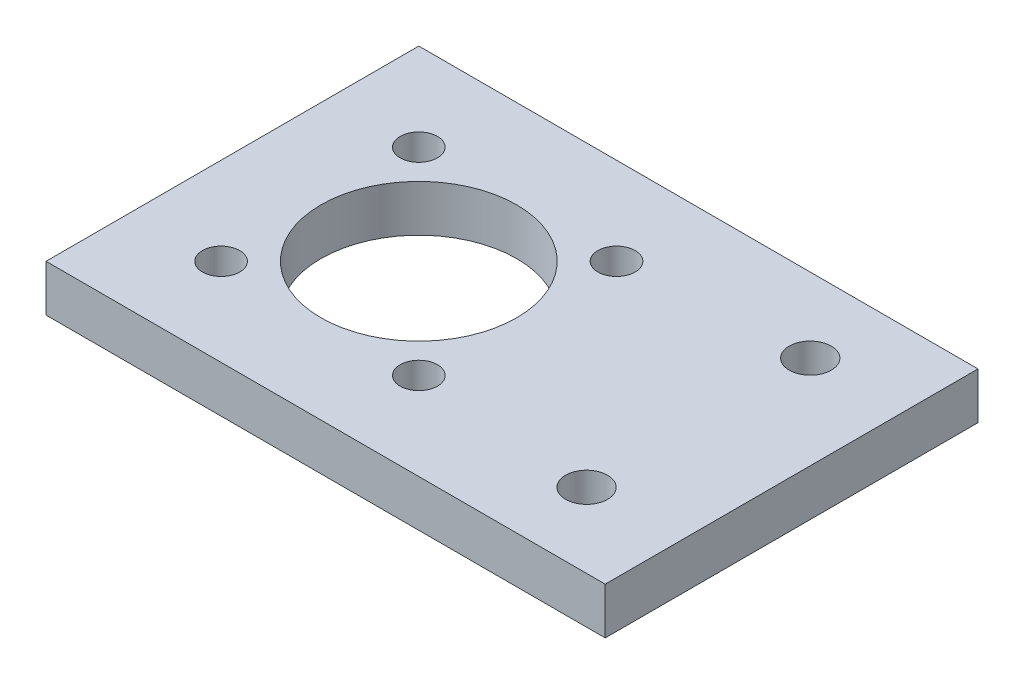
ISO-10303-21;
HEADER;
FILE_DESCRIPTION(('STEP AP214'),'2;1');
FILE_NAME('part.step','',(''),(''),'','','');
FILE_SCHEMA(('AUTOMOTIVE_DESIGN { 1 0 10303 214 1 1 1 1 }'));
ENDSEC;
DATA;
#1=APPLICATION_CONTEXT('core data for automotive mechanical design processes');
#2=APPLICATION_PROTOCOL_DEFINITION('international standard','automotive_design',2000,#1);
#3=PRODUCT_CONTEXT('',#1,'mechanical');
#4=PRODUCT('Part','Part','',(#3));
#5=PRODUCT_RELATED_PRODUCT_CATEGORY('part','',(#4));
#6=PRODUCT_DEFINITION_FORMATION('','',#4);
#7=PRODUCT_DEFINITION_CONTEXT('part definition',#1,'design');
#8=PRODUCT_DEFINITION('design','',#6,#7);
#9=PRODUCT_DEFINITION_SHAPE('','',#8);
#10=(LENGTH_UNIT() NAMED_UNIT(*) SI_UNIT(.MILLI.,.METRE.));
#11=(NAMED_UNIT(*) PLANE_ANGLE_UNIT() SI_UNIT($,.RADIAN.));
#12=(NAMED_UNIT(*) SI_UNIT($,.STERADIAN.) SOLID_ANGLE_UNIT());
#13=UNCERTAINTY_MEASURE_WITH_UNIT(LENGTH_MEASURE(1.E-05),#10,'distance_accuracy_value','');
#14=(GEOMETRIC_REPRESENTATION_CONTEXT(3) GLOBAL_UNCERTAINTY_ASSIGNED_CONTEXT((#13)) GLOBAL_UNIT_ASSIGNED_CONTEXT((#10,
#11,#12)) REPRESENTATION_CONTEXT('',''));
#15=CARTESIAN_POINT('',(0.,0.,0.));
#16=DIRECTION('',(0.,0.,1.));
#17=DIRECTION('',(1.,0.,0.));
#18=AXIS2_PLACEMENT_3D('',#15,#16,#17);
#19=CARTESIAN_POINT('',(30.,5.,20.));
#20=DIRECTION('',(-1.,0.,0.));
#21=DIRECTION('',(0.,0.,1.));
#22=AXIS2_PLACEMENT_3D('',#19,#20,#21);
#23=PLANE('',#22);
#24=DIRECTION('',(0.,0.,-1.));
#25=VECTOR('',#24,1.);
#26=CARTESIAN_POINT('',(30.,0.,20.));
#27=LINE('',#26,#25);
#28=CARTESIAN_POINT('',(30.,0.,20.));
#29=VERTEX_POINT('',#28);
#30=CARTESIAN_POINT('',(30.,0.,-20.));
#31=VERTEX_POINT('',#30);
#32=EDGE_CURVE('E100',#29,#31,#27,.T.);
#33=ORIENTED_EDGE('',*,*,#32,.T.);
#34=DIRECTION('',(0.,-1.,0.));
#35=VECTOR('',#34,1.);
#36=CARTESIAN_POINT('',(30.,5.,-20.));
#37=LINE('',#36,#35);
#38=CARTESIAN_POINT('',(30.,5.,-20.));
#39=VERTEX_POINT('',#38);
#40=EDGE_CURVE('E11',#39,#31,#37,.T.);
#41=ORIENTED_EDGE('',*,*,#40,.F.);
#42=DIRECTION('',(0.,0.,-1.));
#43=VECTOR('',#42,1.);
#44=CARTESIAN_POINT('',(30.,5.,20.));
#45=LINE('',#44,#43);
#46=CARTESIAN_POINT('',(30.,5.,20.));
#47=VERTEX_POINT('',#46);
#48=EDGE_CURVE('E88',#47,#39,#45,.T.);
#49=ORIENTED_EDGE('',*,*,#48,.F.);
#50=DIRECTION('',(0.,-1.,0.));
#51=VECTOR('',#50,1.);
#52=CARTESIAN_POINT('',(30.,5.,20.));
#53=LINE('',#52,#51);
#54=EDGE_CURVE('E96',#47,#29,#53,.T.);
#55=ORIENTED_EDGE('',*,*,#54,.T.);
#56=EDGE_LOOP('',(#33,#41,#49,#55));
#57=FACE_BOUND('',#56,.T.);
#58=ADVANCED_FACE('F37',(#57),#23,.F.);
#59=CARTESIAN_POINT('',(-30.,5.,-20.));
#60=DIRECTION('',(0.,0.,1.));
#61=DIRECTION('',(1.,0.,0.));
#62=AXIS2_PLACEMENT_3D('',#59,#60,#61);
#63=PLANE('',#62);
#64=DIRECTION('',(-1.,0.,0.));
#65=VECTOR('',#64,1.);
#66=CARTESIAN_POINT('',(-30.,0.,-20.));
#67=LINE('',#66,#65);
#68=CARTESIAN_POINT('',(-30.,0.,-20.));
#69=VERTEX_POINT('',#68);
#70=EDGE_CURVE('E92',#31,#69,#67,.T.);
#71=ORIENTED_EDGE('',*,*,#70,.T.);
#72=DIRECTION('',(0.,-1.,0.));
#73=VECTOR('',#72,1.);
#74=CARTESIAN_POINT('',(-30.,5.,-20.));
#75=LINE('',#74,#73);
#76=CARTESIAN_POINT('',(-30.,5.,-20.));
#77=VERTEX_POINT('',#76);
#78=EDGE_CURVE('E45',#77,#69,#75,.T.);
#79=ORIENTED_EDGE('',*,*,#78,.F.);
#80=DIRECTION('',(-1.,0.,0.));
#81=VECTOR('',#80,1.);
#82=CARTESIAN_POINT('',(-30.,5.,-20.));
#83=LINE('',#82,#81);
#84=EDGE_CURVE('E83',#39,#77,#83,.T.);
#85=ORIENTED_EDGE('',*,*,#84,.F.);
#86=ORIENTED_EDGE('',*,*,#40,.T.);
#87=EDGE_LOOP('',(#71,#79,#85,#86));
#88=FACE_BOUND('',#87,.T.);
#89=ADVANCED_FACE('F91',(#88),#63,.F.);
#90=CARTESIAN_POINT('',(-30.,5.,20.));
#91=DIRECTION('',(1.,0.,0.));
#92=DIRECTION('',(0.,0.,-1.));
#93=AXIS2_PLACEMENT_3D('',#90,#91,#92);
#94=PLANE('',#93);
#95=DIRECTION('',(0.,0.,1.));
#96=VECTOR('',#95,1.);
#97=CARTESIAN_POINT('',(-30.,0.,20.));
#98=LINE('',#97,#96);
#99=CARTESIAN_POINT('',(-30.,0.,20.));
#100=VERTEX_POINT('',#99);
#101=EDGE_CURVE('E70',#69,#100,#98,.T.);
#102=ORIENTED_EDGE('',*,*,#101,.T.);
#103=DIRECTION('',(0.,-1.,0.));
#104=VECTOR('',#103,1.);
#105=CARTESIAN_POINT('',(-30.,5.,20.));
#106=LINE('',#105,#104);
#107=CARTESIAN_POINT('',(-30.,5.,20.));
#108=VERTEX_POINT('',#107);
#109=EDGE_CURVE('E93',#108,#100,#106,.T.);
#110=ORIENTED_EDGE('',*,*,#109,.F.);
#111=DIRECTION('',(0.,0.,1.));
#112=VECTOR('',#111,1.);
#113=CARTESIAN_POINT('',(-30.,5.,20.));
#114=LINE('',#113,#112);
#115=EDGE_CURVE('E86',#77,#108,#114,.T.);
#116=ORIENTED_EDGE('',*,*,#115,.F.);
#117=ORIENTED_EDGE('',*,*,#78,.T.);
#118=EDGE_LOOP('',(#102,#110,#116,#117));
#119=FACE_BOUND('',#118,.T.);
#120=ADVANCED_FACE('F94',(#119),#94,.F.);
#121=CARTESIAN_POINT('',(-30.,5.,20.));
#122=DIRECTION('',(0.,0.,-1.));
#123=DIRECTION('',(-1.,0.,0.));
#124=AXIS2_PLACEMENT_3D('',#121,#122,#123);
#125=PLANE('',#124);
#126=DIRECTION('',(1.,0.,0.));
#127=VECTOR('',#126,1.);
#128=CARTESIAN_POINT('',(-30.,0.,20.));
#129=LINE('',#128,#127);
#130=EDGE_CURVE('E76',#100,#29,#129,.T.);
#131=ORIENTED_EDGE('',*,*,#130,.T.);
#132=ORIENTED_EDGE('',*,*,#54,.F.);
#133=DIRECTION('',(1.,0.,0.));
#134=VECTOR('',#133,1.);
#135=CARTESIAN_POINT('',(-30.,5.,20.));
#136=LINE('',#135,#134);
#137=EDGE_CURVE('E53',#108,#47,#136,.T.);
#138=ORIENTED_EDGE('',*,*,#137,.F.);
#139=ORIENTED_EDGE('',*,*,#109,.T.);
#140=EDGE_LOOP('',(#131,#132,#138,#139));
#141=FACE_BOUND('',#140,.T.);
#142=ADVANCED_FACE('F108',(#141),#125,.F.);
#143=CARTESIAN_POINT('',(0.,5.,0.));
#144=DIRECTION('',(0.,-1.,0.));
#145=DIRECTION('',(0.,0.,-1.));
#146=AXIS2_PLACEMENT_3D('',#143,#144,#145);
#147=PLANE('',#146);
#148=CARTESIAN_POINT('',(0.606544962297295,5.,-10.6065273945976));
#149=DIRECTION('',(0.,1.,0.));
#150=DIRECTION('',(0.,0.,1.));
#151=AXIS2_PLACEMENT_3D('',#148,#149,#150);
#152=CIRCLE('',#151,2.);
#153=CARTESIAN_POINT('',(0.606544962297295,5.,-8.60652739459761));
#154=VERTEX_POINT('',#153);
#155=EDGE_CURVE('E129',#154,#154,#152,.T.);
#156=ORIENTED_EDGE('',*,*,#155,.F.);
#157=EDGE_LOOP('',(#156));
#158=FACE_BOUND('',#157,.T.);
#159=CARTESIAN_POINT('',(0.606544962297299,5.,10.6066760409988));
#160=DIRECTION('',(0.,1.,0.));
#161=DIRECTION('',(0.,0.,1.));
#162=AXIS2_PLACEMENT_3D('',#159,#160,#161);
#163=CIRCLE('',#162,2.);
#164=CARTESIAN_POINT('',(0.606544962297299,5.,12.6066760409988));
#165=VERTEX_POINT('',#164);
#166=EDGE_CURVE('E135',#165,#165,#163,.T.);
#167=ORIENTED_EDGE('',*,*,#166,.F.);
#168=EDGE_LOOP('',(#167));
#169=FACE_BOUND('',#168,.T.);
#170=CARTESIAN_POINT('',(-10.0000567555009,5.,7.43232006133109E-05));
#171=DIRECTION('',(0.,1.,0.));
#172=DIRECTION('',(0.,0.,1.));
#173=AXIS2_PLACEMENT_3D('',#170,#171,#172);
#174=CIRCLE('',#173,10.5);
#175=CARTESIAN_POINT('',(-10.0000567555009,5.,10.5000743232006));
#176=VERTEX_POINT('',#175);
#177=EDGE_CURVE('E147',#176,#176,#174,.T.);
#178=ORIENTED_EDGE('',*,*,#177,.F.);
#179=EDGE_LOOP('',(#178));
#180=FACE_BOUND('',#179,.T.);
#181=CARTESIAN_POINT('',(-20.6066584732991,5.,10.6066760409988));
#182=DIRECTION('',(0.,1.,0.));
#183=DIRECTION('',(0.,0.,1.));
#184=AXIS2_PLACEMENT_3D('',#181,#182,#183);
#185=CIRCLE('',#184,2.);
#186=CARTESIAN_POINT('',(-20.6066584732991,5.,12.6066760409988));
#187=VERTEX_POINT('',#186);
#188=EDGE_CURVE('E136',#187,#187,#185,.T.);
#189=ORIENTED_EDGE('',*,*,#188,.F.);
#190=EDGE_LOOP('',(#189));
#191=FACE_BOUND('',#190,.T.);
#192=CARTESIAN_POINT('',(-20.6066584732991,5.,-10.6065273945976));
#193=DIRECTION('',(0.,1.,0.));
#194=DIRECTION('',(0.,0.,1.));
#195=AXIS2_PLACEMENT_3D('',#192,#193,#194);
#196=CIRCLE('',#195,2.);
#197=CARTESIAN_POINT('',(-20.6066584732991,5.,-8.60652739459762));
#198=VERTEX_POINT('',#197);
#199=EDGE_CURVE('E126',#198,#198,#196,.T.);
#200=ORIENTED_EDGE('',*,*,#199,.F.);
#201=EDGE_LOOP('',(#200));
#202=FACE_BOUND('',#201,.T.);
#203=CARTESIAN_POINT('',(20.,5.,-12.));
#204=DIRECTION('',(0.,1.,0.));
#205=DIRECTION('',(0.,0.,1.));
#206=AXIS2_PLACEMENT_3D('',#203,#204,#205);
#207=CIRCLE('',#206,2.25);
#208=CARTESIAN_POINT('',(20.,5.,-9.75));
#209=VERTEX_POINT('',#208);
#210=EDGE_CURVE('E121',#209,#209,#207,.T.);
#211=ORIENTED_EDGE('',*,*,#210,.F.);
#212=EDGE_LOOP('',(#211));
#213=FACE_BOUND('',#212,.T.);
#214=CARTESIAN_POINT('',(20.,5.,12.));
#215=DIRECTION('',(0.,1.,0.));
#216=DIRECTION('',(0.,0.,-1.));
#217=AXIS2_PLACEMENT_3D('',#214,#215,#216);
#218=CIRCLE('',#217,2.25);
#219=CARTESIAN_POINT('',(20.,5.,9.75));
#220=VERTEX_POINT('',#219);
#221=EDGE_CURVE('E117',#220,#220,#218,.T.);
#222=ORIENTED_EDGE('',*,*,#221,.F.);
#223=EDGE_LOOP('',(#222));
#224=FACE_BOUND('',#223,.T.);
#225=ORIENTED_EDGE('',*,*,#48,.T.);
#226=ORIENTED_EDGE('',*,*,#84,.T.);
#227=ORIENTED_EDGE('',*,*,#115,.T.);
#228=ORIENTED_EDGE('',*,*,#137,.T.);
#229=EDGE_LOOP('',(#225,#226,#227,#228));
#230=FACE_BOUND('',#229,.T.);
#231=ADVANCED_FACE('F84',(#158,#169,#180,#191,#202,#213,#224,#230),#147,.F.);
#232=CARTESIAN_POINT('',(0.,0.,0.));
#233=DIRECTION('',(0.,-1.,0.));
#234=DIRECTION('',(0.,0.,-1.));
#235=AXIS2_PLACEMENT_3D('',#232,#233,#234);
#236=PLANE('',#235);
#237=CARTESIAN_POINT('',(0.606544962297295,0.,-10.6065273945976));
#238=DIRECTION('',(0.,1.,0.));
#239=DIRECTION('',(0.,0.,1.));
#240=AXIS2_PLACEMENT_3D('',#237,#238,#239);
#241=CIRCLE('',#240,2.);
#242=CARTESIAN_POINT('',(0.606544962297295,0.,-8.60652739459761));
#243=VERTEX_POINT('',#242);
#244=EDGE_CURVE('E139',#243,#243,#241,.T.);
#245=ORIENTED_EDGE('',*,*,#244,.T.);
#246=EDGE_LOOP('',(#245));
#247=FACE_BOUND('',#246,.T.);
#248=CARTESIAN_POINT('',(0.606544962297299,0.,10.6066760409988));
#249=DIRECTION('',(0.,1.,0.));
#250=DIRECTION('',(0.,0.,1.));
#251=AXIS2_PLACEMENT_3D('',#248,#249,#250);
#252=CIRCLE('',#251,2.);
#253=CARTESIAN_POINT('',(0.606544962297299,0.,12.6066760409988));
#254=VERTEX_POINT('',#253);
#255=EDGE_CURVE('E132',#254,#254,#252,.T.);
#256=ORIENTED_EDGE('',*,*,#255,.T.);
#257=EDGE_LOOP('',(#256));
#258=FACE_BOUND('',#257,.T.);
#259=CARTESIAN_POINT('',(-10.0000567555009,0.,7.43232006133109E-05));
#260=DIRECTION('',(0.,1.,0.));
#261=DIRECTION('',(0.,0.,1.));
#262=AXIS2_PLACEMENT_3D('',#259,#260,#261);
#263=CIRCLE('',#262,10.5);
#264=CARTESIAN_POINT('',(-10.0000567555009,0.,10.5000743232006));
#265=VERTEX_POINT('',#264);
#266=EDGE_CURVE('E150',#265,#265,#263,.T.);
#267=ORIENTED_EDGE('',*,*,#266,.T.);
#268=EDGE_LOOP('',(#267));
#269=FACE_BOUND('',#268,.T.);
#270=CARTESIAN_POINT('',(-20.6066584732991,0.,10.6066760409988));
#271=DIRECTION('',(0.,1.,0.));
#272=DIRECTION('',(0.,0.,1.));
#273=AXIS2_PLACEMENT_3D('',#270,#271,#272);
#274=CIRCLE('',#273,2.);
#275=CARTESIAN_POINT('',(-20.6066584732991,0.,12.6066760409988));
#276=VERTEX_POINT('',#275);
#277=EDGE_CURVE('E144',#276,#276,#274,.T.);
#278=ORIENTED_EDGE('',*,*,#277,.T.);
#279=EDGE_LOOP('',(#278));
#280=FACE_BOUND('',#279,.T.);
#281=CARTESIAN_POINT('',(-20.6066584732991,0.,-10.6065273945976));
#282=DIRECTION('',(0.,1.,0.));
#283=DIRECTION('',(0.,0.,1.));
#284=AXIS2_PLACEMENT_3D('',#281,#282,#283);
#285=CIRCLE('',#284,2.);
#286=CARTESIAN_POINT('',(-20.6066584732991,0.,-8.60652739459762));
#287=VERTEX_POINT('',#286);
#288=EDGE_CURVE('E118',#287,#287,#285,.T.);
#289=ORIENTED_EDGE('',*,*,#288,.T.);
#290=EDGE_LOOP('',(#289));
#291=FACE_BOUND('',#290,.T.);
#292=CARTESIAN_POINT('',(20.,0.,-12.));
#293=DIRECTION('',(0.,1.,0.));
#294=DIRECTION('',(0.,0.,1.));
#295=AXIS2_PLACEMENT_3D('',#292,#293,#294);
#296=CIRCLE('',#295,2.25);
#297=CARTESIAN_POINT('',(20.,0.,-9.75));
#298=VERTEX_POINT('',#297);
#299=EDGE_CURVE('E103',#298,#298,#296,.T.);
#300=ORIENTED_EDGE('',*,*,#299,.T.);
#301=EDGE_LOOP('',(#300));
#302=FACE_BOUND('',#301,.T.);
#303=CARTESIAN_POINT('',(20.,0.,12.));
#304=DIRECTION('',(0.,1.,0.));
#305=DIRECTION('',(0.,0.,-1.));
#306=AXIS2_PLACEMENT_3D('',#303,#304,#305);
#307=CIRCLE('',#306,2.25);
#308=CARTESIAN_POINT('',(20.,0.,9.75));
#309=VERTEX_POINT('',#308);
#310=EDGE_CURVE('E114',#309,#309,#307,.T.);
#311=ORIENTED_EDGE('',*,*,#310,.T.);
#312=EDGE_LOOP('',(#311));
#313=FACE_BOUND('',#312,.T.);
#314=ORIENTED_EDGE('',*,*,#32,.F.);
#315=ORIENTED_EDGE('',*,*,#130,.F.);
#316=ORIENTED_EDGE('',*,*,#101,.F.);
#317=ORIENTED_EDGE('',*,*,#70,.F.);
#318=EDGE_LOOP('',(#314,#315,#316,#317));
#319=FACE_BOUND('',#318,.T.);
#320=ADVANCED_FACE('F111',(#247,#258,#269,#280,#291,#302,#313,#319),#236,.T.);
#321=CARTESIAN_POINT('',(20.,0.,12.));
#322=DIRECTION('',(0.,1.,0.));
#323=DIRECTION('',(0.,0.,1.));
#324=AXIS2_PLACEMENT_3D('',#321,#322,#323);
#325=CYLINDRICAL_SURFACE('',#324,2.25);
#326=ORIENTED_EDGE('',*,*,#310,.F.);
#327=EDGE_LOOP('',(#326));
#328=FACE_BOUND('',#327,.T.);
#329=ORIENTED_EDGE('',*,*,#221,.T.);
#330=EDGE_LOOP('',(#329));
#331=FACE_BOUND('',#330,.T.);
#332=ADVANCED_FACE('F170',(#328,#331),#325,.F.);
#333=CARTESIAN_POINT('',(20.,0.,-12.));
#334=DIRECTION('',(0.,1.,0.));
#335=DIRECTION('',(0.,0.,1.));
#336=AXIS2_PLACEMENT_3D('',#333,#334,#335);
#337=CYLINDRICAL_SURFACE('',#336,2.25);
#338=ORIENTED_EDGE('',*,*,#299,.F.);
#339=EDGE_LOOP('',(#338));
#340=FACE_BOUND('',#339,.T.);
#341=ORIENTED_EDGE('',*,*,#210,.T.);
#342=EDGE_LOOP('',(#341));
#343=FACE_BOUND('',#342,.T.);
#344=ADVANCED_FACE('F172',(#340,#343),#337,.F.);
#345=CARTESIAN_POINT('',(-20.6066584732991,0.,-10.6065273945976));
#346=DIRECTION('',(0.,1.,0.));
#347=DIRECTION('',(0.,0.,1.));
#348=AXIS2_PLACEMENT_3D('',#345,#346,#347);
#349=CYLINDRICAL_SURFACE('',#348,2.);
#350=ORIENTED_EDGE('',*,*,#288,.F.);
#351=EDGE_LOOP('',(#350));
#352=FACE_BOUND('',#351,.T.);
#353=ORIENTED_EDGE('',*,*,#199,.T.);
#354=EDGE_LOOP('',(#353));
#355=FACE_BOUND('',#354,.T.);
#356=ADVANCED_FACE('F179',(#352,#355),#349,.F.);
#357=CARTESIAN_POINT('',(-20.6066584732991,0.,10.6066760409988));
#358=DIRECTION('',(0.,1.,0.));
#359=DIRECTION('',(0.,0.,1.));
#360=AXIS2_PLACEMENT_3D('',#357,#358,#359);
#361=CYLINDRICAL_SURFACE('',#360,2.);
#362=ORIENTED_EDGE('',*,*,#277,.F.);
#363=EDGE_LOOP('',(#362));
#364=FACE_BOUND('',#363,.T.);
#365=ORIENTED_EDGE('',*,*,#188,.T.);
#366=EDGE_LOOP('',(#365));
#367=FACE_BOUND('',#366,.T.);
#368=ADVANCED_FACE('F219',(#364,#367),#361,.F.);
#369=CARTESIAN_POINT('',(-10.0000567555009,0.,7.43232006133109E-05));
#370=DIRECTION('',(0.,1.,0.));
#371=DIRECTION('',(0.,0.,1.));
#372=AXIS2_PLACEMENT_3D('',#369,#370,#371);
#373=CYLINDRICAL_SURFACE('',#372,10.5);
#374=ORIENTED_EDGE('',*,*,#266,.F.);
#375=EDGE_LOOP('',(#374));
#376=FACE_BOUND('',#375,.T.);
#377=ORIENTED_EDGE('',*,*,#177,.T.);
#378=EDGE_LOOP('',(#377));
#379=FACE_BOUND('',#378,.T.);
#380=ADVANCED_FACE('F156',(#376,#379),#373,.F.);
#381=CARTESIAN_POINT('',(0.606544962297299,0.,10.6066760409988));
#382=DIRECTION('',(0.,1.,0.));
#383=DIRECTION('',(0.,0.,1.));
#384=AXIS2_PLACEMENT_3D('',#381,#382,#383);
#385=CYLINDRICAL_SURFACE('',#384,2.);
#386=ORIENTED_EDGE('',*,*,#255,.F.);
#387=EDGE_LOOP('',(#386));
#388=FACE_BOUND('',#387,.T.);
#389=ORIENTED_EDGE('',*,*,#166,.T.);
#390=EDGE_LOOP('',(#389));
#391=FACE_BOUND('',#390,.T.);
#392=ADVANCED_FACE('F241',(#388,#391),#385,.F.);
#393=CARTESIAN_POINT('',(0.606544962297295,0.,-10.6065273945976));
#394=DIRECTION('',(0.,1.,0.));
#395=DIRECTION('',(0.,0.,1.));
#396=AXIS2_PLACEMENT_3D('',#393,#394,#395);
#397=CYLINDRICAL_SURFACE('',#396,2.);
#398=ORIENTED_EDGE('',*,*,#244,.F.);
#399=EDGE_LOOP('',(#398));
#400=FACE_BOUND('',#399,.T.);
#401=ORIENTED_EDGE('',*,*,#155,.T.);
#402=EDGE_LOOP('',(#401));
#403=FACE_BOUND('',#402,.T.);
#404=ADVANCED_FACE('F252',(#400,#403),#397,.F.);
#405=CLOSED_SHELL('',(#58,#89,#120,#142,#231,#320,#332,#344,#356,#368,#380,#392,#404));
#406=MANIFOLD_SOLID_BREP('B2',#405);
#407=ADVANCED_BREP_SHAPE_REPRESENTATION('',(#18,#406),#14);
#408=SHAPE_DEFINITION_REPRESENTATION(#9,#407);
ENDSEC;
END-ISO-10303-21;
